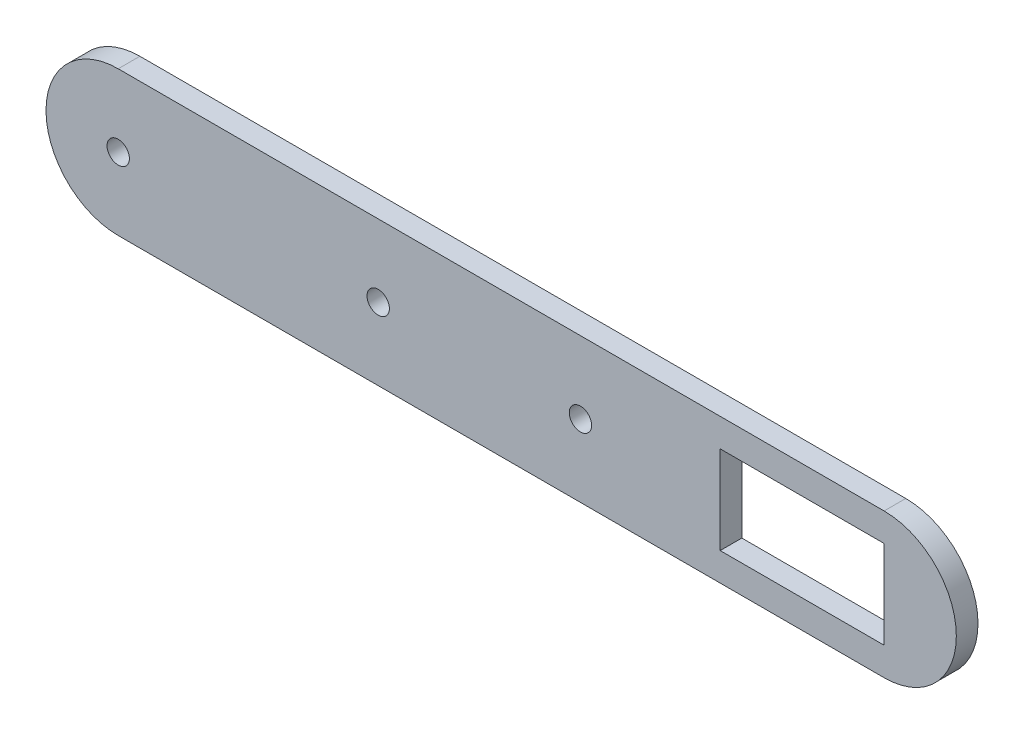
ISO-10303-21;
HEADER;
FILE_DESCRIPTION(('STEP AP214'),'2;1');
FILE_NAME('part.step','',(''),(''),'','','');
FILE_SCHEMA(('AUTOMOTIVE_DESIGN { 1 0 10303 214 1 1 1 1 }'));
ENDSEC;
DATA;
#1=APPLICATION_CONTEXT('core data for automotive mechanical design processes');
#2=APPLICATION_PROTOCOL_DEFINITION('international standard','automotive_design',2000,#1);
#3=PRODUCT_CONTEXT('',#1,'mechanical');
#4=PRODUCT('Part','Part','',(#3));
#5=PRODUCT_RELATED_PRODUCT_CATEGORY('part','',(#4));
#6=PRODUCT_DEFINITION_FORMATION('','',#4);
#7=PRODUCT_DEFINITION_CONTEXT('part definition',#1,'design');
#8=PRODUCT_DEFINITION('design','',#6,#7);
#9=PRODUCT_DEFINITION_SHAPE('','',#8);
#10=(LENGTH_UNIT() NAMED_UNIT(*) SI_UNIT(.MILLI.,.METRE.));
#11=(NAMED_UNIT(*) PLANE_ANGLE_UNIT() SI_UNIT($,.RADIAN.));
#12=(NAMED_UNIT(*) SI_UNIT($,.STERADIAN.) SOLID_ANGLE_UNIT());
#13=UNCERTAINTY_MEASURE_WITH_UNIT(LENGTH_MEASURE(1.E-05),#10,'distance_accuracy_value','');
#14=(GEOMETRIC_REPRESENTATION_CONTEXT(3) GLOBAL_UNCERTAINTY_ASSIGNED_CONTEXT((#13)) GLOBAL_UNIT_ASSIGNED_CONTEXT((#10,
#11,#12)) REPRESENTATION_CONTEXT('',''));
#15=CARTESIAN_POINT('',(0.,0.,0.));
#16=DIRECTION('',(0.,0.,1.));
#17=DIRECTION('',(1.,0.,0.));
#18=AXIS2_PLACEMENT_3D('',#15,#16,#17);
#19=CARTESIAN_POINT('',(-58.0586172408633,14.1910905170263,3.));
#20=DIRECTION('',(0.,0.,-1.));
#21=DIRECTION('',(-1.,0.,0.));
#22=AXIS2_PLACEMENT_3D('',#19,#20,#21);
#23=CYLINDRICAL_SURFACE('',#22,10.);
#24=CARTESIAN_POINT('',(-58.0586172408633,14.1910905170263,0.));
#25=DIRECTION('',(0.,0.,1.));
#26=DIRECTION('',(1.,0.,0.));
#27=AXIS2_PLACEMENT_3D('',#24,#25,#26);
#28=CIRCLE('',#27,10.);
#29=CARTESIAN_POINT('',(-58.0586172408633,24.1910905170263,0.));
#30=VERTEX_POINT('',#29);
#31=CARTESIAN_POINT('',(-58.0586172408633,4.19109051702633,0.));
#32=VERTEX_POINT('',#31);
#33=EDGE_CURVE('E179',#30,#32,#28,.T.);
#34=ORIENTED_EDGE('',*,*,#33,.T.);
#35=DIRECTION('',(0.,0.,-1.));
#36=VECTOR('',#35,1.);
#37=CARTESIAN_POINT('',(-58.0586172408633,4.19109051702633,3.));
#38=LINE('',#37,#36);
#39=CARTESIAN_POINT('',(-58.0586172408633,4.19109051702633,3.));
#40=VERTEX_POINT('',#39);
#41=EDGE_CURVE('E11',#40,#32,#38,.T.);
#42=ORIENTED_EDGE('',*,*,#41,.F.);
#43=CARTESIAN_POINT('',(-58.0586172408633,14.1910905170263,3.));
#44=DIRECTION('',(0.,0.,1.));
#45=DIRECTION('',(1.,0.,0.));
#46=AXIS2_PLACEMENT_3D('',#43,#44,#45);
#47=CIRCLE('',#46,10.);
#48=CARTESIAN_POINT('',(-58.0586172408633,24.1910905170263,3.));
#49=VERTEX_POINT('',#48);
#50=EDGE_CURVE('E183',#49,#40,#47,.T.);
#51=ORIENTED_EDGE('',*,*,#50,.F.);
#52=DIRECTION('',(0.,0.,-1.));
#53=VECTOR('',#52,1.);
#54=CARTESIAN_POINT('',(-58.0586172408633,24.1910905170263,3.));
#55=LINE('',#54,#53);
#56=EDGE_CURVE('E197',#49,#30,#55,.T.);
#57=ORIENTED_EDGE('',*,*,#56,.T.);
#58=EDGE_LOOP('',(#34,#42,#51,#57));
#59=FACE_BOUND('',#58,.T.);
#60=ADVANCED_FACE('F45',(#59),#23,.T.);
#61=CARTESIAN_POINT('',(-58.0586172408633,4.19109051702633,3.));
#62=DIRECTION('',(0.,1.,0.));
#63=DIRECTION('',(0.,0.,1.));
#64=AXIS2_PLACEMENT_3D('',#61,#62,#63);
#65=PLANE('',#64);
#66=DIRECTION('',(1.,0.,0.));
#67=VECTOR('',#66,1.);
#68=CARTESIAN_POINT('',(-58.0586172408633,4.19109051702633,0.));
#69=LINE('',#68,#67);
#70=CARTESIAN_POINT('',(47.9913827591367,4.19109051702633,0.));
#71=VERTEX_POINT('',#70);
#72=EDGE_CURVE('E201',#32,#71,#69,.T.);
#73=ORIENTED_EDGE('',*,*,#72,.T.);
#74=DIRECTION('',(0.,0.,-1.));
#75=VECTOR('',#74,1.);
#76=CARTESIAN_POINT('',(47.9913827591367,4.19109051702633,3.));
#77=LINE('',#76,#75);
#78=CARTESIAN_POINT('',(47.9913827591367,4.19109051702633,3.));
#79=VERTEX_POINT('',#78);
#80=EDGE_CURVE('E53',#79,#71,#77,.T.);
#81=ORIENTED_EDGE('',*,*,#80,.F.);
#82=DIRECTION('',(1.,0.,0.));
#83=VECTOR('',#82,1.);
#84=CARTESIAN_POINT('',(-58.0586172408633,4.19109051702633,3.));
#85=LINE('',#84,#83);
#86=EDGE_CURVE('E187',#40,#79,#85,.T.);
#87=ORIENTED_EDGE('',*,*,#86,.F.);
#88=ORIENTED_EDGE('',*,*,#41,.T.);
#89=EDGE_LOOP('',(#73,#81,#87,#88));
#90=FACE_BOUND('',#89,.T.);
#91=ADVANCED_FACE('F236',(#90),#65,.F.);
#92=CARTESIAN_POINT('',(47.9913827591367,14.1910905170263,3.));
#93=DIRECTION('',(0.,0.,-1.));
#94=DIRECTION('',(-1.,0.,0.));
#95=AXIS2_PLACEMENT_3D('',#92,#93,#94);
#96=CYLINDRICAL_SURFACE('',#95,10.);
#97=CARTESIAN_POINT('',(47.9913827591367,14.1910905170263,0.));
#98=DIRECTION('',(0.,0.,1.));
#99=DIRECTION('',(1.,0.,0.));
#100=AXIS2_PLACEMENT_3D('',#97,#98,#99);
#101=CIRCLE('',#100,10.);
#102=CARTESIAN_POINT('',(47.9913827591367,24.1910905170263,0.));
#103=VERTEX_POINT('',#102);
#104=EDGE_CURVE('E204',#71,#103,#101,.T.);
#105=ORIENTED_EDGE('',*,*,#104,.T.);
#106=DIRECTION('',(0.,0.,-1.));
#107=VECTOR('',#106,1.);
#108=CARTESIAN_POINT('',(47.9913827591367,24.1910905170263,3.));
#109=LINE('',#108,#107);
#110=CARTESIAN_POINT('',(47.9913827591367,24.1910905170263,3.));
#111=VERTEX_POINT('',#110);
#112=EDGE_CURVE('E212',#111,#103,#109,.T.);
#113=ORIENTED_EDGE('',*,*,#112,.F.);
#114=CARTESIAN_POINT('',(47.9913827591367,14.1910905170263,3.));
#115=DIRECTION('',(0.,0.,1.));
#116=DIRECTION('',(1.,0.,0.));
#117=AXIS2_PLACEMENT_3D('',#114,#115,#116);
#118=CIRCLE('',#117,10.);
#119=EDGE_CURVE('E191',#79,#111,#118,.T.);
#120=ORIENTED_EDGE('',*,*,#119,.F.);
#121=ORIENTED_EDGE('',*,*,#80,.T.);
#122=EDGE_LOOP('',(#105,#113,#120,#121));
#123=FACE_BOUND('',#122,.T.);
#124=ADVANCED_FACE('F221',(#123),#96,.T.);
#125=CARTESIAN_POINT('',(-58.0586172408633,24.1910905170263,3.));
#126=DIRECTION('',(0.,-1.,0.));
#127=DIRECTION('',(0.,0.,-1.));
#128=AXIS2_PLACEMENT_3D('',#125,#126,#127);
#129=PLANE('',#128);
#130=DIRECTION('',(-1.,0.,0.));
#131=VECTOR('',#130,1.);
#132=CARTESIAN_POINT('',(-58.0586172408633,24.1910905170263,0.));
#133=LINE('',#132,#131);
#134=EDGE_CURVE('E188',#103,#30,#133,.T.);
#135=ORIENTED_EDGE('',*,*,#134,.T.);
#136=ORIENTED_EDGE('',*,*,#56,.F.);
#137=DIRECTION('',(-1.,0.,0.));
#138=VECTOR('',#137,1.);
#139=CARTESIAN_POINT('',(-58.0586172408633,24.1910905170263,3.));
#140=LINE('',#139,#138);
#141=EDGE_CURVE('E194',#111,#49,#140,.T.);
#142=ORIENTED_EDGE('',*,*,#141,.F.);
#143=ORIENTED_EDGE('',*,*,#112,.T.);
#144=EDGE_LOOP('',(#135,#136,#142,#143));
#145=FACE_BOUND('',#144,.T.);
#146=ADVANCED_FACE('F229',(#145),#129,.F.);
#147=CARTESIAN_POINT('',(-58.0586172408633,14.1910905170263,3.));
#148=DIRECTION('',(0.,0.,1.));
#149=DIRECTION('',(1.,0.,0.));
#150=AXIS2_PLACEMENT_3D('',#147,#148,#149);
#151=PLANE('',#150);
#152=DIRECTION('',(0.,-1.,0.));
#153=VECTOR('',#152,1.);
#154=CARTESIAN_POINT('',(25.2913827591367,20.2910905170263,3.));
#155=LINE('',#154,#153);
#156=CARTESIAN_POINT('',(25.2913827591367,20.2910905170263,3.));
#157=VERTEX_POINT('',#156);
#158=CARTESIAN_POINT('',(25.2913827591367,8.09109051702633,3.));
#159=VERTEX_POINT('',#158);
#160=EDGE_CURVE('E60',#157,#159,#155,.T.);
#161=ORIENTED_EDGE('',*,*,#160,.F.);
#162=DIRECTION('',(-1.,0.,0.));
#163=VECTOR('',#162,1.);
#164=CARTESIAN_POINT('',(25.2913827591367,20.2910905170263,3.));
#165=LINE('',#164,#163);
#166=CARTESIAN_POINT('',(47.9913827591367,20.2910905170263,3.));
#167=VERTEX_POINT('',#166);
#168=EDGE_CURVE('E131',#167,#157,#165,.T.);
#169=ORIENTED_EDGE('',*,*,#168,.F.);
#170=DIRECTION('',(0.,1.,0.));
#171=VECTOR('',#170,1.);
#172=CARTESIAN_POINT('',(47.9913827591367,20.2910905170263,3.));
#173=LINE('',#172,#171);
#174=CARTESIAN_POINT('',(47.9913827591367,8.09109051702635,3.));
#175=VERTEX_POINT('',#174);
#176=EDGE_CURVE('E135',#175,#167,#173,.T.);
#177=ORIENTED_EDGE('',*,*,#176,.F.);
#178=DIRECTION('',(1.,0.,0.));
#179=VECTOR('',#178,1.);
#180=CARTESIAN_POINT('',(25.2913827591367,8.09109051702633,3.));
#181=LINE('',#180,#179);
#182=EDGE_CURVE('E144',#159,#175,#181,.T.);
#183=ORIENTED_EDGE('',*,*,#182,.F.);
#184=EDGE_LOOP('',(#161,#169,#177,#183));
#185=FACE_BOUND('',#184,.T.);
#186=CARTESIAN_POINT('',(-22.0586172408633,14.1910905170263,3.));
#187=DIRECTION('',(0.,0.,-1.));
#188=DIRECTION('',(-1.,0.,0.));
#189=AXIS2_PLACEMENT_3D('',#186,#187,#188);
#190=CIRCLE('',#189,1.55);
#191=CARTESIAN_POINT('',(-23.6086172408633,14.1910905170263,3.));
#192=VERTEX_POINT('',#191);
#193=EDGE_CURVE('E159',#192,#192,#190,.T.);
#194=ORIENTED_EDGE('',*,*,#193,.T.);
#195=EDGE_LOOP('',(#194));
#196=FACE_BOUND('',#195,.T.);
#197=CARTESIAN_POINT('',(5.94138275913674,14.1910905170263,3.));
#198=DIRECTION('',(0.,0.,1.));
#199=DIRECTION('',(1.,0.,0.));
#200=AXIS2_PLACEMENT_3D('',#197,#198,#199);
#201=CIRCLE('',#200,1.55);
#202=CARTESIAN_POINT('',(7.49138275913674,14.1910905170263,3.));
#203=VERTEX_POINT('',#202);
#204=EDGE_CURVE('E163',#203,#203,#201,.T.);
#205=ORIENTED_EDGE('',*,*,#204,.F.);
#206=EDGE_LOOP('',(#205));
#207=FACE_BOUND('',#206,.T.);
#208=CARTESIAN_POINT('',(-58.0586172408633,14.1910905170263,3.));
#209=DIRECTION('',(0.,0.,1.));
#210=DIRECTION('',(1.,0.,0.));
#211=AXIS2_PLACEMENT_3D('',#208,#209,#210);
#212=CIRCLE('',#211,1.55);
#213=CARTESIAN_POINT('',(-56.5086172408633,14.1910905170263,3.));
#214=VERTEX_POINT('',#213);
#215=EDGE_CURVE('E171',#214,#214,#212,.T.);
#216=ORIENTED_EDGE('',*,*,#215,.F.);
#217=EDGE_LOOP('',(#216));
#218=FACE_BOUND('',#217,.T.);
#219=ORIENTED_EDGE('',*,*,#50,.T.);
#220=ORIENTED_EDGE('',*,*,#86,.T.);
#221=ORIENTED_EDGE('',*,*,#119,.T.);
#222=ORIENTED_EDGE('',*,*,#141,.T.);
#223=EDGE_LOOP('',(#219,#220,#221,#222));
#224=FACE_BOUND('',#223,.T.);
#225=ADVANCED_FACE('F235',(#185,#196,#207,#218,#224),#151,.T.);
#226=CARTESIAN_POINT('',(-58.0586172408633,14.1910905170263,0.));
#227=DIRECTION('',(0.,0.,1.));
#228=DIRECTION('',(1.,0.,0.));
#229=AXIS2_PLACEMENT_3D('',#226,#227,#228);
#230=PLANE('',#229);
#231=DIRECTION('',(-1.,0.,0.));
#232=VECTOR('',#231,1.);
#233=CARTESIAN_POINT('',(25.2913827591367,20.2910905170263,0.));
#234=LINE('',#233,#232);
#235=CARTESIAN_POINT('',(47.9913827591367,20.2910905170263,0.));
#236=VERTEX_POINT('',#235);
#237=CARTESIAN_POINT('',(25.2913827591367,20.2910905170263,0.));
#238=VERTEX_POINT('',#237);
#239=EDGE_CURVE('E119',#236,#238,#234,.T.);
#240=ORIENTED_EDGE('',*,*,#239,.T.);
#241=DIRECTION('',(0.,-1.,0.));
#242=VECTOR('',#241,1.);
#243=CARTESIAN_POINT('',(25.2913827591367,20.2910905170263,0.));
#244=LINE('',#243,#242);
#245=CARTESIAN_POINT('',(25.2913827591367,8.09109051702633,0.));
#246=VERTEX_POINT('',#245);
#247=EDGE_CURVE('E112',#238,#246,#244,.T.);
#248=ORIENTED_EDGE('',*,*,#247,.T.);
#249=DIRECTION('',(1.,0.,0.));
#250=VECTOR('',#249,1.);
#251=CARTESIAN_POINT('',(25.2913827591367,8.09109051702633,0.));
#252=LINE('',#251,#250);
#253=CARTESIAN_POINT('',(47.9913827591367,8.09109051702635,0.));
#254=VERTEX_POINT('',#253);
#255=EDGE_CURVE('E122',#246,#254,#252,.T.);
#256=ORIENTED_EDGE('',*,*,#255,.T.);
#257=DIRECTION('',(0.,1.,0.));
#258=VECTOR('',#257,1.);
#259=CARTESIAN_POINT('',(47.9913827591367,20.2910905170263,0.));
#260=LINE('',#259,#258);
#261=EDGE_CURVE('E68',#254,#236,#260,.T.);
#262=ORIENTED_EDGE('',*,*,#261,.T.);
#263=EDGE_LOOP('',(#240,#248,#256,#262));
#264=FACE_BOUND('',#263,.T.);
#265=CARTESIAN_POINT('',(-22.0586172408633,14.1910905170263,0.));
#266=DIRECTION('',(0.,0.,-1.));
#267=DIRECTION('',(-1.,0.,0.));
#268=AXIS2_PLACEMENT_3D('',#265,#266,#267);
#269=CIRCLE('',#268,1.55);
#270=CARTESIAN_POINT('',(-23.6086172408633,14.1910905170263,0.));
#271=VERTEX_POINT('',#270);
#272=EDGE_CURVE('E153',#271,#271,#269,.T.);
#273=ORIENTED_EDGE('',*,*,#272,.F.);
#274=EDGE_LOOP('',(#273));
#275=FACE_BOUND('',#274,.T.);
#276=CARTESIAN_POINT('',(5.94138275913674,14.1910905170263,0.));
#277=DIRECTION('',(0.,0.,1.));
#278=DIRECTION('',(1.,0.,0.));
#279=AXIS2_PLACEMENT_3D('',#276,#277,#278);
#280=CIRCLE('',#279,1.55);
#281=CARTESIAN_POINT('',(7.49138275913674,14.1910905170263,0.));
#282=VERTEX_POINT('',#281);
#283=EDGE_CURVE('E167',#282,#282,#280,.T.);
#284=ORIENTED_EDGE('',*,*,#283,.T.);
#285=EDGE_LOOP('',(#284));
#286=FACE_BOUND('',#285,.T.);
#287=CARTESIAN_POINT('',(-58.0586172408633,14.1910905170263,0.));
#288=DIRECTION('',(0.,0.,1.));
#289=DIRECTION('',(1.,0.,0.));
#290=AXIS2_PLACEMENT_3D('',#287,#288,#289);
#291=CIRCLE('',#290,1.55);
#292=CARTESIAN_POINT('',(-56.5086172408633,14.1910905170263,0.));
#293=VERTEX_POINT('',#292);
#294=EDGE_CURVE('E175',#293,#293,#291,.T.);
#295=ORIENTED_EDGE('',*,*,#294,.T.);
#296=EDGE_LOOP('',(#295));
#297=FACE_BOUND('',#296,.T.);
#298=ORIENTED_EDGE('',*,*,#33,.F.);
#299=ORIENTED_EDGE('',*,*,#134,.F.);
#300=ORIENTED_EDGE('',*,*,#104,.F.);
#301=ORIENTED_EDGE('',*,*,#72,.F.);
#302=EDGE_LOOP('',(#298,#299,#300,#301));
#303=FACE_BOUND('',#302,.T.);
#304=ADVANCED_FACE('F127',(#264,#275,#286,#297,#303),#230,.F.);
#305=CARTESIAN_POINT('',(-58.0586172408633,14.1910905170263,0.));
#306=DIRECTION('',(0.,0.,1.));
#307=DIRECTION('',(1.,0.,0.));
#308=AXIS2_PLACEMENT_3D('',#305,#306,#307);
#309=CYLINDRICAL_SURFACE('',#308,1.55);
#310=ORIENTED_EDGE('',*,*,#294,.F.);
#311=EDGE_LOOP('',(#310));
#312=FACE_BOUND('',#311,.T.);
#313=ORIENTED_EDGE('',*,*,#215,.T.);
#314=EDGE_LOOP('',(#313));
#315=FACE_BOUND('',#314,.T.);
#316=ADVANCED_FACE('F248',(#312,#315),#309,.F.);
#317=CARTESIAN_POINT('',(5.94138275913674,14.1910905170263,0.));
#318=DIRECTION('',(0.,0.,1.));
#319=DIRECTION('',(1.,0.,0.));
#320=AXIS2_PLACEMENT_3D('',#317,#318,#319);
#321=CYLINDRICAL_SURFACE('',#320,1.55);
#322=ORIENTED_EDGE('',*,*,#283,.F.);
#323=EDGE_LOOP('',(#322));
#324=FACE_BOUND('',#323,.T.);
#325=ORIENTED_EDGE('',*,*,#204,.T.);
#326=EDGE_LOOP('',(#325));
#327=FACE_BOUND('',#326,.T.);
#328=ADVANCED_FACE('F254',(#324,#327),#321,.F.);
#329=CARTESIAN_POINT('',(-22.0586172408633,14.1910905170263,3.));
#330=DIRECTION('',(0.,0.,-1.));
#331=DIRECTION('',(-1.,0.,0.));
#332=AXIS2_PLACEMENT_3D('',#329,#330,#331);
#333=CYLINDRICAL_SURFACE('',#332,1.55);
#334=ORIENTED_EDGE('',*,*,#193,.F.);
#335=EDGE_LOOP('',(#334));
#336=FACE_BOUND('',#335,.T.);
#337=ORIENTED_EDGE('',*,*,#272,.T.);
#338=EDGE_LOOP('',(#337));
#339=FACE_BOUND('',#338,.T.);
#340=ADVANCED_FACE('F258',(#336,#339),#333,.F.);
#341=CARTESIAN_POINT('',(25.2913827591367,20.2910905170263,0.));
#342=DIRECTION('',(-1.,0.,0.));
#343=DIRECTION('',(0.,-1.,0.));
#344=AXIS2_PLACEMENT_3D('',#341,#342,#343);
#345=PLANE('',#344);
#346=ORIENTED_EDGE('',*,*,#160,.T.);
#347=DIRECTION('',(0.,0.,1.));
#348=VECTOR('',#347,1.);
#349=CARTESIAN_POINT('',(25.2913827591367,8.09109051702633,0.));
#350=LINE('',#349,#348);
#351=EDGE_CURVE('E108',#246,#159,#350,.T.);
#352=ORIENTED_EDGE('',*,*,#351,.F.);
#353=ORIENTED_EDGE('',*,*,#247,.F.);
#354=DIRECTION('',(0.,0.,1.));
#355=VECTOR('',#354,1.);
#356=CARTESIAN_POINT('',(25.2913827591367,20.2910905170263,0.));
#357=LINE('',#356,#355);
#358=EDGE_CURVE('E150',#238,#157,#357,.T.);
#359=ORIENTED_EDGE('',*,*,#358,.T.);
#360=EDGE_LOOP('',(#346,#352,#353,#359));
#361=FACE_BOUND('',#360,.T.);
#362=ADVANCED_FACE('F110',(#361),#345,.F.);
#363=CARTESIAN_POINT('',(25.2913827591367,20.2910905170263,0.));
#364=DIRECTION('',(0.,1.,0.));
#365=DIRECTION('',(-1.,0.,0.));
#366=AXIS2_PLACEMENT_3D('',#363,#364,#365);
#367=PLANE('',#366);
#368=ORIENTED_EDGE('',*,*,#168,.T.);
#369=ORIENTED_EDGE('',*,*,#358,.F.);
#370=ORIENTED_EDGE('',*,*,#239,.F.);
#371=DIRECTION('',(0.,0.,1.));
#372=VECTOR('',#371,1.);
#373=CARTESIAN_POINT('',(47.9913827591367,20.2910905170263,0.));
#374=LINE('',#373,#372);
#375=EDGE_CURVE('E154',#236,#167,#374,.T.);
#376=ORIENTED_EDGE('',*,*,#375,.T.);
#377=EDGE_LOOP('',(#368,#369,#370,#376));
#378=FACE_BOUND('',#377,.T.);
#379=ADVANCED_FACE('F265',(#378),#367,.F.);
#380=CARTESIAN_POINT('',(47.9913827591367,20.2910905170263,0.));
#381=DIRECTION('',(1.,0.,0.));
#382=DIRECTION('',(0.,1.,0.));
#383=AXIS2_PLACEMENT_3D('',#380,#381,#382);
#384=PLANE('',#383);
#385=ORIENTED_EDGE('',*,*,#176,.T.);
#386=ORIENTED_EDGE('',*,*,#375,.F.);
#387=ORIENTED_EDGE('',*,*,#261,.F.);
#388=DIRECTION('',(0.,0.,1.));
#389=VECTOR('',#388,1.);
#390=CARTESIAN_POINT('',(47.9913827591367,8.09109051702635,0.));
#391=LINE('',#390,#389);
#392=EDGE_CURVE('E118',#254,#175,#391,.T.);
#393=ORIENTED_EDGE('',*,*,#392,.T.);
#394=EDGE_LOOP('',(#385,#386,#387,#393));
#395=FACE_BOUND('',#394,.T.);
#396=ADVANCED_FACE('F268',(#395),#384,.F.);
#397=CARTESIAN_POINT('',(25.2913827591367,8.09109051702633,0.));
#398=DIRECTION('',(0.,-1.,0.));
#399=DIRECTION('',(1.,0.,0.));
#400=AXIS2_PLACEMENT_3D('',#397,#398,#399);
#401=PLANE('',#400);
#402=ORIENTED_EDGE('',*,*,#182,.T.);
#403=ORIENTED_EDGE('',*,*,#392,.F.);
#404=ORIENTED_EDGE('',*,*,#255,.F.);
#405=ORIENTED_EDGE('',*,*,#351,.T.);
#406=EDGE_LOOP('',(#402,#403,#404,#405));
#407=FACE_BOUND('',#406,.T.);
#408=ADVANCED_FACE('F123',(#407),#401,.F.);
#409=CLOSED_SHELL('',(#60,#91,#124,#146,#225,#304,#316,#328,#340,#362,#379,#396,#408));
#410=MANIFOLD_SOLID_BREP('B2',#409);
#411=ADVANCED_BREP_SHAPE_REPRESENTATION('',(#18,#410),#14);
#412=SHAPE_DEFINITION_REPRESENTATION(#9,#411);
ENDSEC;
END-ISO-10303-21;
